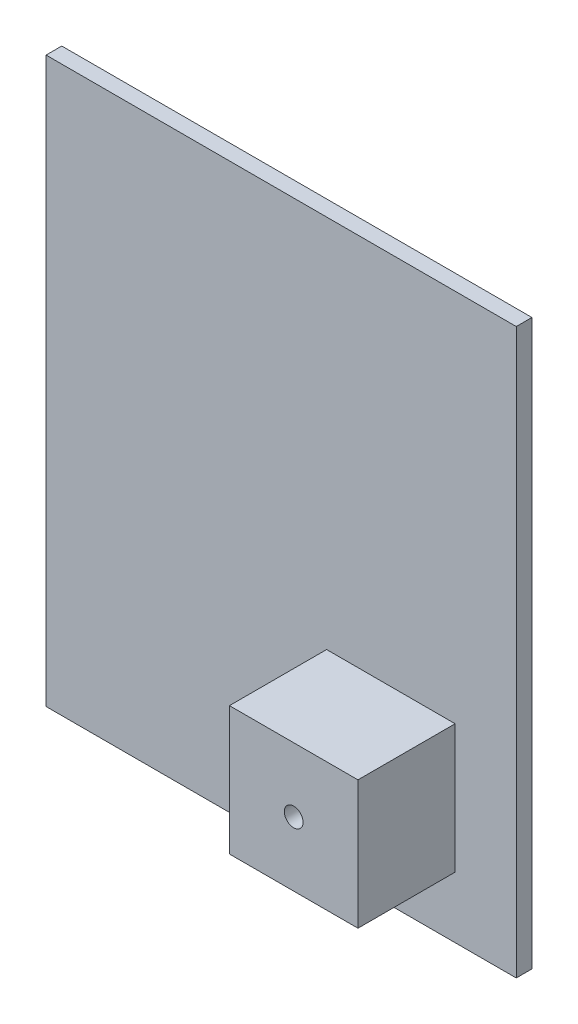
ISO-10303-21;
HEADER;
FILE_DESCRIPTION(('STEP AP214'),'2;1');
FILE_NAME('part.step','',(''),(''),'','','');
FILE_SCHEMA(('AUTOMOTIVE_DESIGN { 1 0 10303 214 1 1 1 1 }'));
ENDSEC;
DATA;
#1=APPLICATION_CONTEXT('core data for automotive mechanical design processes');
#2=APPLICATION_PROTOCOL_DEFINITION('international standard','automotive_design',2000,#1);
#3=PRODUCT_CONTEXT('',#1,'mechanical');
#4=PRODUCT('Part','Part','',(#3));
#5=PRODUCT_RELATED_PRODUCT_CATEGORY('part','',(#4));
#6=PRODUCT_DEFINITION_FORMATION('','',#4);
#7=PRODUCT_DEFINITION_CONTEXT('part definition',#1,'design');
#8=PRODUCT_DEFINITION('design','',#6,#7);
#9=PRODUCT_DEFINITION_SHAPE('','',#8);
#10=(LENGTH_UNIT() NAMED_UNIT(*) SI_UNIT(.MILLI.,.METRE.));
#11=(NAMED_UNIT(*) PLANE_ANGLE_UNIT() SI_UNIT($,.RADIAN.));
#12=(NAMED_UNIT(*) SI_UNIT($,.STERADIAN.) SOLID_ANGLE_UNIT());
#13=UNCERTAINTY_MEASURE_WITH_UNIT(LENGTH_MEASURE(1.E-05),#10,'distance_accuracy_value','');
#14=(GEOMETRIC_REPRESENTATION_CONTEXT(3) GLOBAL_UNCERTAINTY_ASSIGNED_CONTEXT((#13)) GLOBAL_UNIT_ASSIGNED_CONTEXT((#10,
#11,#12)) REPRESENTATION_CONTEXT('',''));
#15=CARTESIAN_POINT('',(0.,0.,0.));
#16=DIRECTION('',(0.,0.,1.));
#17=DIRECTION('',(1.,0.,0.));
#18=AXIS2_PLACEMENT_3D('',#15,#16,#17);
#19=CARTESIAN_POINT('',(35.,-50.,-20.));
#20=DIRECTION('',(0.,0.,1.));
#21=DIRECTION('',(1.,0.,0.));
#22=AXIS2_PLACEMENT_3D('',#19,#20,#21);
#23=CYLINDRICAL_SURFACE('',#22,3.);
#24=CARTESIAN_POINT('',(35.,-50.,-20.));
#25=DIRECTION('',(0.,0.,1.));
#26=DIRECTION('',(1.,0.,0.));
#27=AXIS2_PLACEMENT_3D('',#24,#25,#26);
#28=CIRCLE('',#27,3.);
#29=CARTESIAN_POINT('',(38.,-50.,-20.));
#30=VERTEX_POINT('',#29);
#31=EDGE_CURVE('E11',#30,#30,#28,.T.);
#32=ORIENTED_EDGE('',*,*,#31,.T.);
#33=EDGE_LOOP('',(#32));
#34=FACE_BOUND('',#33,.T.);
#35=CARTESIAN_POINT('',(35.,-50.,0.));
#36=DIRECTION('',(0.,0.,1.));
#37=DIRECTION('',(1.,0.,0.));
#38=AXIS2_PLACEMENT_3D('',#35,#36,#37);
#39=CIRCLE('',#38,3.);
#40=CARTESIAN_POINT('',(38.,-50.,0.));
#41=VERTEX_POINT('',#40);
#42=EDGE_CURVE('E44',#41,#41,#39,.T.);
#43=ORIENTED_EDGE('',*,*,#42,.F.);
#44=EDGE_LOOP('',(#43));
#45=FACE_BOUND('',#44,.T.);
#46=ADVANCED_FACE('F41',(#34,#45),#23,.T.);
#47=CARTESIAN_POINT('',(0.,0.,-20.));
#48=DIRECTION('',(0.,0.,1.));
#49=DIRECTION('',(1.,0.,0.));
#50=AXIS2_PLACEMENT_3D('',#47,#48,#49);
#51=PLANE('',#50);
#52=ORIENTED_EDGE('',*,*,#31,.F.);
#53=EDGE_LOOP('',(#52));
#54=FACE_BOUND('',#53,.T.);
#55=ADVANCED_FACE('F56',(#54),#51,.F.);
#56=CARTESIAN_POINT('',(0.,0.,0.));
#57=DIRECTION('',(0.,0.,1.));
#58=DIRECTION('',(1.,0.,0.));
#59=AXIS2_PLACEMENT_3D('',#56,#57,#58);
#60=PLANE('',#59);
#61=ORIENTED_EDGE('',*,*,#42,.T.);
#62=EDGE_LOOP('',(#61));
#63=FACE_BOUND('',#62,.T.);
#64=ADVANCED_FACE('F53',(#63),#60,.T.);
#65=CLOSED_SHELL('',(#46,#55,#64));
#66=MANIFOLD_SOLID_BREP('B2',#65);
#67=CARTESIAN_POINT('',(-75.,0.,5.));
#68=DIRECTION('',(-1.,0.,0.));
#69=DIRECTION('',(0.,0.,1.));
#70=AXIS2_PLACEMENT_3D('',#67,#68,#69);
#71=PLANE('',#70);
#72=DIRECTION('',(0.,1.,0.));
#73=VECTOR('',#72,1.);
#74=CARTESIAN_POINT('',(-75.,0.,0.));
#75=LINE('',#74,#73);
#76=CARTESIAN_POINT('',(-75.,-90.,0.));
#77=VERTEX_POINT('',#76);
#78=CARTESIAN_POINT('',(-75.,90.,0.));
#79=VERTEX_POINT('',#78);
#80=EDGE_CURVE('E166',#77,#79,#75,.T.);
#81=ORIENTED_EDGE('',*,*,#80,.F.);
#82=DIRECTION('',(0.,0.,-1.));
#83=VECTOR('',#82,1.);
#84=CARTESIAN_POINT('',(-75.,-90.,5.));
#85=LINE('',#84,#83);
#86=CARTESIAN_POINT('',(-75.,-90.,5.));
#87=VERTEX_POINT('',#86);
#88=EDGE_CURVE('E39',#87,#77,#85,.T.);
#89=ORIENTED_EDGE('',*,*,#88,.F.);
#90=DIRECTION('',(0.,1.,0.));
#91=VECTOR('',#90,1.);
#92=CARTESIAN_POINT('',(-75.,0.,5.));
#93=LINE('',#92,#91);
#94=CARTESIAN_POINT('',(-75.,90.,5.));
#95=VERTEX_POINT('',#94);
#96=EDGE_CURVE('E176',#87,#95,#93,.T.);
#97=ORIENTED_EDGE('',*,*,#96,.T.);
#98=DIRECTION('',(0.,0.,-1.));
#99=VECTOR('',#98,1.);
#100=CARTESIAN_POINT('',(-75.,90.,5.));
#101=LINE('',#100,#99);
#102=EDGE_CURVE('E122',#95,#79,#101,.T.);
#103=ORIENTED_EDGE('',*,*,#102,.T.);
#104=EDGE_LOOP('',(#81,#89,#97,#103));
#105=FACE_BOUND('',#104,.T.);
#106=ADVANCED_FACE('F82',(#105),#71,.T.);
#107=CARTESIAN_POINT('',(0.,-90.,5.));
#108=DIRECTION('',(0.,-1.,0.));
#109=DIRECTION('',(1.,0.,0.));
#110=AXIS2_PLACEMENT_3D('',#107,#108,#109);
#111=PLANE('',#110);
#112=DIRECTION('',(-1.,0.,0.));
#113=VECTOR('',#112,1.);
#114=CARTESIAN_POINT('',(0.,-90.,0.));
#115=LINE('',#114,#113);
#116=CARTESIAN_POINT('',(75.,-90.,0.));
#117=VERTEX_POINT('',#116);
#118=EDGE_CURVE('E170',#117,#77,#115,.T.);
#119=ORIENTED_EDGE('',*,*,#118,.F.);
#120=DIRECTION('',(0.,0.,-1.));
#121=VECTOR('',#120,1.);
#122=CARTESIAN_POINT('',(75.,-90.,5.));
#123=LINE('',#122,#121);
#124=CARTESIAN_POINT('',(75.,-90.,5.));
#125=VERTEX_POINT('',#124);
#126=EDGE_CURVE('E90',#125,#117,#123,.T.);
#127=ORIENTED_EDGE('',*,*,#126,.F.);
#128=DIRECTION('',(-1.,0.,0.));
#129=VECTOR('',#128,1.);
#130=CARTESIAN_POINT('',(0.,-90.,5.));
#131=LINE('',#130,#129);
#132=EDGE_CURVE('E178',#125,#87,#131,.T.);
#133=ORIENTED_EDGE('',*,*,#132,.T.);
#134=ORIENTED_EDGE('',*,*,#88,.T.);
#135=EDGE_LOOP('',(#119,#127,#133,#134));
#136=FACE_BOUND('',#135,.T.);
#137=ADVANCED_FACE('F202',(#136),#111,.T.);
#138=CARTESIAN_POINT('',(75.,0.,5.));
#139=DIRECTION('',(-1.,0.,0.));
#140=DIRECTION('',(0.,-1.,0.));
#141=AXIS2_PLACEMENT_3D('',#138,#139,#140);
#142=PLANE('',#141);
#143=DIRECTION('',(0.,1.,0.));
#144=VECTOR('',#143,1.);
#145=CARTESIAN_POINT('',(75.,0.,0.));
#146=LINE('',#145,#144);
#147=CARTESIAN_POINT('',(75.,90.,0.));
#148=VERTEX_POINT('',#147);
#149=EDGE_CURVE('E114',#117,#148,#146,.T.);
#150=ORIENTED_EDGE('',*,*,#149,.T.);
#151=DIRECTION('',(0.,0.,-1.));
#152=VECTOR('',#151,1.);
#153=CARTESIAN_POINT('',(75.,90.,5.));
#154=LINE('',#153,#152);
#155=CARTESIAN_POINT('',(75.,90.,5.));
#156=VERTEX_POINT('',#155);
#157=EDGE_CURVE('E192',#156,#148,#154,.T.);
#158=ORIENTED_EDGE('',*,*,#157,.F.);
#159=DIRECTION('',(0.,1.,0.));
#160=VECTOR('',#159,1.);
#161=CARTESIAN_POINT('',(75.,0.,5.));
#162=LINE('',#161,#160);
#163=EDGE_CURVE('E182',#125,#156,#162,.T.);
#164=ORIENTED_EDGE('',*,*,#163,.F.);
#165=ORIENTED_EDGE('',*,*,#126,.T.);
#166=EDGE_LOOP('',(#150,#158,#164,#165));
#167=FACE_BOUND('',#166,.T.);
#168=ADVANCED_FACE('F194',(#167),#142,.F.);
#169=CARTESIAN_POINT('',(0.,90.,5.));
#170=DIRECTION('',(0.,-1.,0.));
#171=DIRECTION('',(1.,0.,0.));
#172=AXIS2_PLACEMENT_3D('',#169,#170,#171);
#173=PLANE('',#172);
#174=DIRECTION('',(-1.,0.,0.));
#175=VECTOR('',#174,1.);
#176=CARTESIAN_POINT('',(0.,90.,0.));
#177=LINE('',#176,#175);
#178=EDGE_CURVE('E179',#148,#79,#177,.T.);
#179=ORIENTED_EDGE('',*,*,#178,.T.);
#180=ORIENTED_EDGE('',*,*,#102,.F.);
#181=DIRECTION('',(-1.,0.,0.));
#182=VECTOR('',#181,1.);
#183=CARTESIAN_POINT('',(0.,90.,5.));
#184=LINE('',#183,#182);
#185=EDGE_CURVE('E148',#156,#95,#184,.T.);
#186=ORIENTED_EDGE('',*,*,#185,.F.);
#187=ORIENTED_EDGE('',*,*,#157,.T.);
#188=EDGE_LOOP('',(#179,#180,#186,#187));
#189=FACE_BOUND('',#188,.T.);
#190=ADVANCED_FACE('F210',(#189),#173,.F.);
#191=CARTESIAN_POINT('',(0.,0.,5.));
#192=DIRECTION('',(0.,0.,1.));
#193=DIRECTION('',(1.,0.,0.));
#194=AXIS2_PLACEMENT_3D('',#191,#192,#193);
#195=PLANE('',#194);
#196=ORIENTED_EDGE('',*,*,#96,.F.);
#197=ORIENTED_EDGE('',*,*,#132,.F.);
#198=ORIENTED_EDGE('',*,*,#163,.T.);
#199=ORIENTED_EDGE('',*,*,#185,.T.);
#200=EDGE_LOOP('',(#196,#197,#198,#199));
#201=FACE_BOUND('',#200,.T.);
#202=DIRECTION('',(-1.,0.,0.));
#203=VECTOR('',#202,1.);
#204=CARTESIAN_POINT('',(0.,-70.5,5.));
#205=LINE('',#204,#203);
#206=CARTESIAN_POINT('',(55.5,-70.5,5.));
#207=VERTEX_POINT('',#206);
#208=CARTESIAN_POINT('',(14.5,-70.5,5.));
#209=VERTEX_POINT('',#208);
#210=EDGE_CURVE('E139',#207,#209,#205,.T.);
#211=ORIENTED_EDGE('',*,*,#210,.T.);
#212=DIRECTION('',(0.,1.,0.));
#213=VECTOR('',#212,1.);
#214=CARTESIAN_POINT('',(14.5,0.,5.));
#215=LINE('',#214,#213);
#216=CARTESIAN_POINT('',(14.5,-29.5,5.));
#217=VERTEX_POINT('',#216);
#218=EDGE_CURVE('E142',#209,#217,#215,.T.);
#219=ORIENTED_EDGE('',*,*,#218,.T.);
#220=DIRECTION('',(-1.,0.,0.));
#221=VECTOR('',#220,1.);
#222=CARTESIAN_POINT('',(0.,-29.5,5.));
#223=LINE('',#222,#221);
#224=CARTESIAN_POINT('',(55.5,-29.5,5.));
#225=VERTEX_POINT('',#224);
#226=EDGE_CURVE('E160',#225,#217,#223,.T.);
#227=ORIENTED_EDGE('',*,*,#226,.F.);
#228=DIRECTION('',(0.,1.,0.));
#229=VECTOR('',#228,1.);
#230=CARTESIAN_POINT('',(55.5,0.,5.));
#231=LINE('',#230,#229);
#232=EDGE_CURVE('E98',#207,#225,#231,.T.);
#233=ORIENTED_EDGE('',*,*,#232,.F.);
#234=EDGE_LOOP('',(#211,#219,#227,#233));
#235=FACE_BOUND('',#234,.T.);
#236=ADVANCED_FACE('F141',(#201,#235),#195,.T.);
#237=CARTESIAN_POINT('',(0.,0.,0.));
#238=DIRECTION('',(0.,0.,1.));
#239=DIRECTION('',(1.,0.,0.));
#240=AXIS2_PLACEMENT_3D('',#237,#238,#239);
#241=PLANE('',#240);
#242=ORIENTED_EDGE('',*,*,#80,.T.);
#243=ORIENTED_EDGE('',*,*,#178,.F.);
#244=ORIENTED_EDGE('',*,*,#149,.F.);
#245=ORIENTED_EDGE('',*,*,#118,.T.);
#246=EDGE_LOOP('',(#242,#243,#244,#245));
#247=FACE_BOUND('',#246,.T.);
#248=CARTESIAN_POINT('',(35.,-50.,0.));
#249=DIRECTION('',(0.,0.,1.));
#250=DIRECTION('',(1.,0.,0.));
#251=AXIS2_PLACEMENT_3D('',#248,#249,#250);
#252=CIRCLE('',#251,3.);
#253=CARTESIAN_POINT('',(38.,-50.,0.));
#254=VERTEX_POINT('',#253);
#255=EDGE_CURVE('E257',#254,#254,#252,.T.);
#256=ORIENTED_EDGE('',*,*,#255,.T.);
#257=EDGE_LOOP('',(#256));
#258=FACE_BOUND('',#257,.T.);
#259=ADVANCED_FACE('F200',(#247,#258),#241,.F.);
#260=CARTESIAN_POINT('',(14.5,0.,36.));
#261=DIRECTION('',(-1.,0.,0.));
#262=DIRECTION('',(0.,0.,1.));
#263=AXIS2_PLACEMENT_3D('',#260,#261,#262);
#264=PLANE('',#263);
#265=DIRECTION('',(0.,0.,-1.));
#266=VECTOR('',#265,1.);
#267=CARTESIAN_POINT('',(14.5,-29.5,36.));
#268=LINE('',#267,#266);
#269=CARTESIAN_POINT('',(14.5,-29.5,36.));
#270=VERTEX_POINT('',#269);
#271=EDGE_CURVE('E159',#270,#217,#268,.T.);
#272=ORIENTED_EDGE('',*,*,#271,.T.);
#273=ORIENTED_EDGE('',*,*,#218,.F.);
#274=DIRECTION('',(0.,0.,-1.));
#275=VECTOR('',#274,1.);
#276=CARTESIAN_POINT('',(14.5,-70.5,36.));
#277=LINE('',#276,#275);
#278=CARTESIAN_POINT('',(14.5,-70.5,36.));
#279=VERTEX_POINT('',#278);
#280=EDGE_CURVE('E156',#279,#209,#277,.T.);
#281=ORIENTED_EDGE('',*,*,#280,.F.);
#282=DIRECTION('',(0.,1.,0.));
#283=VECTOR('',#282,1.);
#284=CARTESIAN_POINT('',(14.5,0.,36.));
#285=LINE('',#284,#283);
#286=EDGE_CURVE('E247',#279,#270,#285,.T.);
#287=ORIENTED_EDGE('',*,*,#286,.T.);
#288=EDGE_LOOP('',(#272,#273,#281,#287));
#289=FACE_BOUND('',#288,.T.);
#290=ADVANCED_FACE('F153',(#289),#264,.T.);
#291=CARTESIAN_POINT('',(0.,-70.5,36.));
#292=DIRECTION('',(0.,-1.,0.));
#293=DIRECTION('',(0.,0.,-1.));
#294=AXIS2_PLACEMENT_3D('',#291,#292,#293);
#295=PLANE('',#294);
#296=ORIENTED_EDGE('',*,*,#280,.T.);
#297=ORIENTED_EDGE('',*,*,#210,.F.);
#298=DIRECTION('',(0.,0.,-1.));
#299=VECTOR('',#298,1.);
#300=CARTESIAN_POINT('',(55.5,-70.5,36.));
#301=LINE('',#300,#299);
#302=CARTESIAN_POINT('',(55.5,-70.5,36.));
#303=VERTEX_POINT('',#302);
#304=EDGE_CURVE('E167',#303,#207,#301,.T.);
#305=ORIENTED_EDGE('',*,*,#304,.F.);
#306=DIRECTION('',(-1.,0.,0.));
#307=VECTOR('',#306,1.);
#308=CARTESIAN_POINT('',(0.,-70.5,36.));
#309=LINE('',#308,#307);
#310=EDGE_CURVE('E165',#303,#279,#309,.T.);
#311=ORIENTED_EDGE('',*,*,#310,.T.);
#312=EDGE_LOOP('',(#296,#297,#305,#311));
#313=FACE_BOUND('',#312,.T.);
#314=ADVANCED_FACE('F163',(#313),#295,.T.);
#315=CARTESIAN_POINT('',(55.5,0.,36.));
#316=DIRECTION('',(-1.,0.,0.));
#317=DIRECTION('',(0.,0.,1.));
#318=AXIS2_PLACEMENT_3D('',#315,#316,#317);
#319=PLANE('',#318);
#320=ORIENTED_EDGE('',*,*,#232,.T.);
#321=DIRECTION('',(0.,0.,-1.));
#322=VECTOR('',#321,1.);
#323=CARTESIAN_POINT('',(55.5,-29.5,36.));
#324=LINE('',#323,#322);
#325=CARTESIAN_POINT('',(55.5,-29.5,36.));
#326=VERTEX_POINT('',#325);
#327=EDGE_CURVE('E172',#326,#225,#324,.T.);
#328=ORIENTED_EDGE('',*,*,#327,.F.);
#329=DIRECTION('',(0.,1.,0.));
#330=VECTOR('',#329,1.);
#331=CARTESIAN_POINT('',(55.5,0.,36.));
#332=LINE('',#331,#330);
#333=EDGE_CURVE('E255',#303,#326,#332,.T.);
#334=ORIENTED_EDGE('',*,*,#333,.F.);
#335=ORIENTED_EDGE('',*,*,#304,.T.);
#336=EDGE_LOOP('',(#320,#328,#334,#335));
#337=FACE_BOUND('',#336,.T.);
#338=ADVANCED_FACE('F225',(#337),#319,.F.);
#339=CARTESIAN_POINT('',(35.,-50.,36.));
#340=DIRECTION('',(0.,0.,-1.));
#341=DIRECTION('',(-1.,0.,0.));
#342=AXIS2_PLACEMENT_3D('',#339,#340,#341);
#343=CYLINDRICAL_SURFACE('',#342,3.);
#344=CARTESIAN_POINT('',(35.,-50.,36.));
#345=DIRECTION('',(0.,0.,1.));
#346=DIRECTION('',(1.,0.,0.));
#347=AXIS2_PLACEMENT_3D('',#344,#345,#346);
#348=CIRCLE('',#347,3.);
#349=CARTESIAN_POINT('',(38.,-50.,36.));
#350=VERTEX_POINT('',#349);
#351=EDGE_CURVE('E245',#350,#350,#348,.T.);
#352=ORIENTED_EDGE('',*,*,#351,.T.);
#353=EDGE_LOOP('',(#352));
#354=FACE_BOUND('',#353,.T.);
#355=ORIENTED_EDGE('',*,*,#255,.F.);
#356=EDGE_LOOP('',(#355));
#357=FACE_BOUND('',#356,.T.);
#358=ADVANCED_FACE('F221',(#354,#357),#343,.F.);
#359=CARTESIAN_POINT('',(0.,-29.5,36.));
#360=DIRECTION('',(0.,-1.,0.));
#361=DIRECTION('',(1.,0.,0.));
#362=AXIS2_PLACEMENT_3D('',#359,#360,#361);
#363=PLANE('',#362);
#364=ORIENTED_EDGE('',*,*,#226,.T.);
#365=ORIENTED_EDGE('',*,*,#271,.F.);
#366=DIRECTION('',(-1.,0.,0.));
#367=VECTOR('',#366,1.);
#368=CARTESIAN_POINT('',(0.,-29.5,36.));
#369=LINE('',#368,#367);
#370=EDGE_CURVE('E252',#326,#270,#369,.T.);
#371=ORIENTED_EDGE('',*,*,#370,.F.);
#372=ORIENTED_EDGE('',*,*,#327,.T.);
#373=EDGE_LOOP('',(#364,#365,#371,#372));
#374=FACE_BOUND('',#373,.T.);
#375=ADVANCED_FACE('F224',(#374),#363,.F.);
#376=CARTESIAN_POINT('',(0.,0.,36.));
#377=DIRECTION('',(0.,0.,1.));
#378=DIRECTION('',(1.,0.,0.));
#379=AXIS2_PLACEMENT_3D('',#376,#377,#378);
#380=PLANE('',#379);
#381=ORIENTED_EDGE('',*,*,#351,.F.);
#382=EDGE_LOOP('',(#381));
#383=FACE_BOUND('',#382,.T.);
#384=ORIENTED_EDGE('',*,*,#286,.F.);
#385=ORIENTED_EDGE('',*,*,#310,.F.);
#386=ORIENTED_EDGE('',*,*,#333,.T.);
#387=ORIENTED_EDGE('',*,*,#370,.T.);
#388=EDGE_LOOP('',(#384,#385,#386,#387));
#389=FACE_BOUND('',#388,.T.);
#390=ADVANCED_FACE('F236',(#383,#389),#380,.T.);
#391=CLOSED_SHELL('',(#106,#137,#168,#190,#236,#259,#290,#314,#338,#358,#375,#390));
#392=MANIFOLD_SOLID_BREP('B6',#391);
#393=ADVANCED_BREP_SHAPE_REPRESENTATION('',(#18,#66,#392),#14);
#394=SHAPE_DEFINITION_REPRESENTATION(#9,#393);
ENDSEC;
END-ISO-10303-21;
